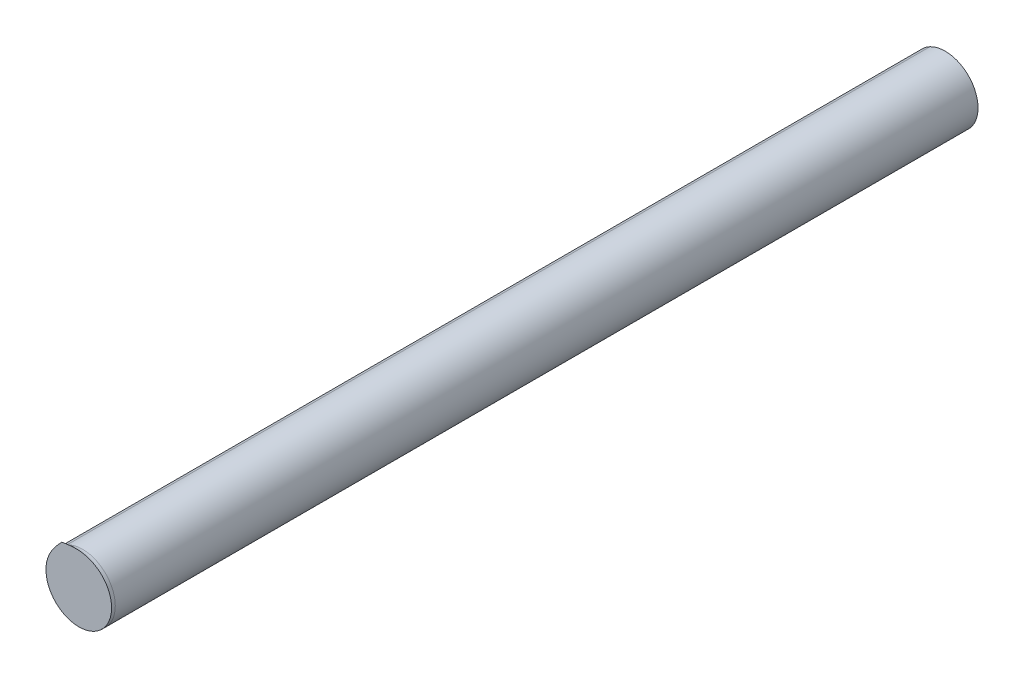
ISO-10303-21;
HEADER;
FILE_DESCRIPTION(('STEP AP214'),'2;1');
FILE_NAME('part.step','',(''),(''),'','','');
FILE_SCHEMA(('AUTOMOTIVE_DESIGN { 1 0 10303 214 1 1 1 1 }'));
ENDSEC;
DATA;
#1=APPLICATION_CONTEXT('core data for automotive mechanical design processes');
#2=APPLICATION_PROTOCOL_DEFINITION('international standard','automotive_design',2000,#1);
#3=PRODUCT_CONTEXT('',#1,'mechanical');
#4=PRODUCT('Part','Part','',(#3));
#5=PRODUCT_RELATED_PRODUCT_CATEGORY('part','',(#4));
#6=PRODUCT_DEFINITION_FORMATION('','',#4);
#7=PRODUCT_DEFINITION_CONTEXT('part definition',#1,'design');
#8=PRODUCT_DEFINITION('design','',#6,#7);
#9=PRODUCT_DEFINITION_SHAPE('','',#8);
#10=(LENGTH_UNIT() NAMED_UNIT(*) SI_UNIT(.MILLI.,.METRE.));
#11=(NAMED_UNIT(*) PLANE_ANGLE_UNIT() SI_UNIT($,.RADIAN.));
#12=(NAMED_UNIT(*) SI_UNIT($,.STERADIAN.) SOLID_ANGLE_UNIT());
#13=UNCERTAINTY_MEASURE_WITH_UNIT(LENGTH_MEASURE(1.E-05),#10,'distance_accuracy_value','');
#14=(GEOMETRIC_REPRESENTATION_CONTEXT(3) GLOBAL_UNCERTAINTY_ASSIGNED_CONTEXT((#13)) GLOBAL_UNIT_ASSIGNED_CONTEXT((#10,
#11,#12)) REPRESENTATION_CONTEXT('',''));
#15=CARTESIAN_POINT('',(0.,0.,0.));
#16=DIRECTION('',(0.,0.,1.));
#17=DIRECTION('',(1.,0.,0.));
#18=AXIS2_PLACEMENT_3D('',#15,#16,#17);
#19=CARTESIAN_POINT('',(2.552462506594,0.304851094896,-7.3152));
#20=DIRECTION('',(0.,0.,1.));
#21=DIRECTION('',(1.,0.,0.));
#22=AXIS2_PLACEMENT_3D('',#19,#20,#21);
#23=PLANE('',#22);
#24=CARTESIAN_POINT('',(2.552462506594,0.304851094896,-7.3152));
#25=DIRECTION('',(0.,0.,1.));
#26=DIRECTION('',(-0.467775560933961,0.883847285786927,0.));
#27=AXIS2_PLACEMENT_3D('',#24,#25,#26);
#28=CIRCLE('',#27,0.2286);
#29=CARTESIAN_POINT('',(2.445529013364,0.506898584427,-7.3152));
#30=VERTEX_POINT('',#29);
#31=CARTESIAN_POINT('',(2.659395999823,0.102803605365,-7.3152));
#32=VERTEX_POINT('',#31);
#33=EDGE_CURVE('E74',#30,#32,#28,.T.);
#34=ORIENTED_EDGE('',*,*,#33,.F.);
#35=CARTESIAN_POINT('',(2.552462506594,0.304851094896,-7.3152));
#36=DIRECTION('',(0.,0.,1.));
#37=DIRECTION('',(0.467775560933961,-0.883847285786927,0.));
#38=AXIS2_PLACEMENT_3D('',#35,#36,#37);
#39=CIRCLE('',#38,0.2286);
#40=EDGE_CURVE('E11',#32,#30,#39,.T.);
#41=ORIENTED_EDGE('',*,*,#40,.F.);
#42=EDGE_LOOP('',(#34,#41));
#43=FACE_BOUND('',#42,.T.);
#44=ADVANCED_FACE('F16',(#43),#23,.F.);
#45=CARTESIAN_POINT('',(2.552462506594,0.304851094896,-1.175004));
#46=DIRECTION('',(0.,0.,1.));
#47=DIRECTION('',(-0.467775560935937,0.883847285785881,0.));
#48=AXIS2_PLACEMENT_3D('',#45,#46,#47);
#49=CYLINDRICAL_SURFACE('',#48,0.2286);
#50=DIRECTION('',(0.,0.,1.));
#51=VECTOR('',#50,1.);
#52=CARTESIAN_POINT('',(2.659395999823,0.102803605365,-7.3152));
#53=LINE('',#52,#51);
#54=CARTESIAN_POINT('',(2.659395999823,0.102803605365,-1.2954));
#55=VERTEX_POINT('',#54);
#56=EDGE_CURVE('E27',#32,#55,#53,.T.);
#57=ORIENTED_EDGE('',*,*,#56,.F.);
#58=ORIENTED_EDGE('',*,*,#40,.T.);
#59=DIRECTION('',(0.,0.,-1.));
#60=VECTOR('',#59,1.);
#61=CARTESIAN_POINT('',(2.445529013364,0.506898584427,-1.2954));
#62=LINE('',#61,#60);
#63=CARTESIAN_POINT('',(2.445529013364,0.506898584427,-1.2954));
#64=VERTEX_POINT('',#63);
#65=EDGE_CURVE('E69',#64,#30,#62,.T.);
#66=ORIENTED_EDGE('',*,*,#65,.F.);
#67=CARTESIAN_POINT('',(2.552462506594,0.304851094896,-1.2954));
#68=DIRECTION('',(0.,0.,1.));
#69=DIRECTION('',(0.467775560933961,-0.883847285786927,0.));
#70=AXIS2_PLACEMENT_3D('',#67,#68,#69);
#71=CIRCLE('',#70,0.2286);
#72=EDGE_CURVE('E71',#55,#64,#71,.T.);
#73=ORIENTED_EDGE('',*,*,#72,.F.);
#74=EDGE_LOOP('',(#57,#58,#66,#73));
#75=FACE_BOUND('',#74,.T.);
#76=ADVANCED_FACE('F18',(#75),#49,.T.);
#77=CARTESIAN_POINT('',(2.552462506594,0.304851094896,-1.175004));
#78=DIRECTION('',(0.,0.,1.));
#79=DIRECTION('',(-0.467775560935937,0.883847285785881,0.));
#80=AXIS2_PLACEMENT_3D('',#77,#78,#79);
#81=CYLINDRICAL_SURFACE('',#80,0.2286);
#82=ORIENTED_EDGE('',*,*,#65,.T.);
#83=ORIENTED_EDGE('',*,*,#33,.T.);
#84=ORIENTED_EDGE('',*,*,#56,.T.);
#85=CARTESIAN_POINT('',(2.552462506594,0.304851094896,-1.2954));
#86=DIRECTION('',(0.,0.,1.));
#87=DIRECTION('',(-0.467775560935937,0.883847285785881,0.));
#88=AXIS2_PLACEMENT_3D('',#85,#86,#87);
#89=CIRCLE('',#88,0.2286);
#90=EDGE_CURVE('E75',#64,#55,#89,.T.);
#91=ORIENTED_EDGE('',*,*,#90,.F.);
#92=EDGE_LOOP('',(#82,#83,#84,#91));
#93=FACE_BOUND('',#92,.T.);
#94=ADVANCED_FACE('F78',(#93),#81,.T.);
#95=CARTESIAN_POINT('',(2.433647514116,0.529348305486,-1.2954));
#96=DIRECTION('',(0.883847285786927,0.467775560933961,0.));
#97=DIRECTION('',(0.,0.,-1.));
#98=AXIS2_PLACEMENT_3D('',#95,#96,#97);
#99=TOROIDAL_SURFACE('',#98,0.254,0.2286);
#100=CARTESIAN_POINT('',(2.433647514116,0.529348305486,-1.2954));
#101=DIRECTION('',(-0.883847285786927,-0.467775560933961,0.));
#102=DIRECTION('',(0.467775560933961,-0.883847285786927,0.));
#103=AXIS2_PLACEMENT_3D('',#100,#101,#102);
#104=CIRCLE('',#103,0.0254);
#105=CARTESIAN_POINT('',(2.433647514116,0.529348305486,-1.27));
#106=VERTEX_POINT('',#105);
#107=EDGE_CURVE('E84',#64,#106,#104,.T.);
#108=ORIENTED_EDGE('',*,*,#107,.F.);
#109=ORIENTED_EDGE('',*,*,#90,.T.);
#110=CARTESIAN_POINT('',(2.433647514116,0.529348305486,-1.2954));
#111=DIRECTION('',(0.883847285786737,0.46777556093432,0.));
#112=DIRECTION('',(0.467127223046947,-0.8826222716349,0.052631578947404));
#113=AXIS2_PLACEMENT_3D('',#110,#111,#112);
#114=CIRCLE('',#113,0.4826);
#115=CARTESIAN_POINT('',(2.659083111958,0.103394797195,-1.27));
#116=VERTEX_POINT('',#115);
#117=EDGE_CURVE('E20',#116,#55,#114,.T.);
#118=ORIENTED_EDGE('',*,*,#117,.F.);
#119=CARTESIAN_POINT('',(2.433647514116,0.529348305486,-1.27));
#120=CARTESIAN_POINT('',(2.426350525861,0.521705783658,-1.27));
#121=CARTESIAN_POINT('',(2.412542538473,0.507208242984,-1.27));
#122=CARTESIAN_POINT('',(2.394987999441,0.487482414724,-1.27));
#123=CARTESIAN_POINT('',(2.380121048054,0.468948764031,-1.27));
#124=CARTESIAN_POINT('',(2.367519717214,0.451136015618,-1.27));
#125=CARTESIAN_POINT('',(2.356699596837,0.433497909899,-1.27));
#126=CARTESIAN_POINT('',(2.347350192833,0.415581999554,-1.27));
#127=CARTESIAN_POINT('',(2.339194631542,0.396685331612,-1.27));
#128=CARTESIAN_POINT('',(2.332171707986,0.376002038655,-1.27));
#129=CARTESIAN_POINT('',(2.326510859808,0.35260532121,-1.27));
#130=CARTESIAN_POINT('',(2.322994041198,0.326324832893,-1.27));
#131=CARTESIAN_POINT('',(2.322467046259,0.298825239669,-1.27));
#132=CARTESIAN_POINT('',(2.325228959274,0.270956818124,-1.27));
#133=CARTESIAN_POINT('',(2.33123212225,0.243876603143,-1.27));
#134=CARTESIAN_POINT('',(2.340320902448,0.217898868685,-1.27));
#135=CARTESIAN_POINT('',(2.352318983572,0.193341783895,-1.27));
#136=CARTESIAN_POINT('',(2.367200942917,0.170278263527,-1.27));
#137=CARTESIAN_POINT('',(2.384593480133,0.149280035834,-1.27));
#138=CARTESIAN_POINT('',(2.404400482756,0.130437856968,-1.27));
#139=CARTESIAN_POINT('',(2.426187526687,0.114157260827,-1.27));
#140=CARTESIAN_POINT('',(2.449828111391,0.100525664072,-1.27));
#141=CARTESIAN_POINT('',(2.474807963867,0.08983898453229,-1.27));
#142=CARTESIAN_POINT('',(2.500955400242,0.08216355675663,-1.27));
#143=CARTESIAN_POINT('',(2.527734434613,0.07765825149233,-1.27));
#144=CARTESIAN_POINT('',(2.554925772366,0.07635348499519,-1.27));
#145=CARTESIAN_POINT('',(2.58201242486,0.0782789502587,-1.27));
#146=CARTESIAN_POINT('',(2.608718510388,0.08340425230996,-1.27));
#147=CARTESIAN_POINT('',(2.634618121122,0.09166491972476,-1.27));
#148=CARTESIAN_POINT('',(2.651052882397,0.09914480378757,-1.27));
#149=CARTESIAN_POINT('',(2.659083111958,0.103394797195,-1.27));
#150=(BOUNDED_CURVE() B_SPLINE_CURVE(3,(#119,#120,#121,#122,#123,#124,#125,#126,#127,#128,#129,
#130,#131,#132,#133,#134,#135,#136,#137,#138,#139,#140,#141,#142,#143,#144,#145,#146,#147,#148,
#149),.UNSPECIFIED.,.F.,.F.) B_SPLINE_CURVE_WITH_KNOTS((4,1,1,1,1,1,1,1,1,1,1,1,1,1,1,1,1,1,1,1,
1,1,1,1,1,1,1,1,4),(0.,0.03571428571429,0.07142857142857,0.107142857143,0.142857142857,
0.178571428571,0.214285714286,0.25,0.285714285714,0.321428571429,0.357142857143,0.392857142857,
0.428571428571,0.464285714286,0.5,0.535714285714,0.571428571429,0.607142857143,0.642857142857,
0.678571428571,0.714285714286,0.75,0.785714285714,0.821428571429,0.857142857143,0.892857142857,
0.928571428571,0.964285714286,1.),
.UNSPECIFIED.) CURVE() GEOMETRIC_REPRESENTATION_ITEM() RATIONAL_B_SPLINE_CURVE((1.,1.,1.,1.,1.,
1.,1.,1.,1.,1.,1.,1.,1.,1.,1.,1.,1.,1.,1.,1.,1.,1.,1.,1.,1.,1.,1.,1.,1.,1.,1.)) REPRESENTATION_ITEM(''));
#151=EDGE_CURVE('E53',#106,#116,#150,.T.);
#152=ORIENTED_EDGE('',*,*,#151,.F.);
#153=EDGE_LOOP('',(#108,#109,#118,#152));
#154=FACE_BOUND('',#153,.T.);
#155=ADVANCED_FACE('F85',(#154),#99,.T.);
#156=CARTESIAN_POINT('',(2.551711724829,0.308363292569,-1.27));
#157=DIRECTION('',(0.,0.,1.));
#158=DIRECTION('',(1.,0.,0.));
#159=AXIS2_PLACEMENT_3D('',#156,#157,#158);
#160=PLANE('',#159);
#161=ORIENTED_EDGE('',*,*,#151,.T.);
#162=CARTESIAN_POINT('',(2.433647514116,0.529348305486,-1.27));
#163=CARTESIAN_POINT('',(2.444180655601,0.531102455274,-1.27));
#164=CARTESIAN_POINT('',(2.464117700007,0.53439647131,-1.27));
#165=CARTESIAN_POINT('',(2.490468507455,0.537822781516,-1.27));
#166=CARTESIAN_POINT('',(2.514221930977,0.539668915858,-1.27));
#167=CARTESIAN_POINT('',(2.536045700677,0.540035763034,-1.27));
#168=CARTESIAN_POINT('',(2.556599483435,0.539033043917,-1.27));
#169=CARTESIAN_POINT('',(2.576457706063,0.536690522004,-1.27));
#170=CARTESIAN_POINT('',(2.596513884374,0.532827493612,-1.27));
#171=CARTESIAN_POINT('',(2.617521709434,0.527022637428,-1.27));
#172=CARTESIAN_POINT('',(2.640251623619,0.518451324381,-1.27));
#173=CARTESIAN_POINT('',(2.663749408117,0.506666280142,-1.27));
#174=CARTESIAN_POINT('',(2.686871900228,0.49159318911,-1.27));
#175=CARTESIAN_POINT('',(2.708538941004,0.473447653261,-1.27));
#176=CARTESIAN_POINT('',(2.727496032094,0.45324426674,-1.27));
#177=CARTESIAN_POINT('',(2.743779114036,0.431189247508,-1.27));
#178=CARTESIAN_POINT('',(2.757322196942,0.407436723999,-1.27));
#179=CARTESIAN_POINT('',(2.767991978491,0.382169968642,-1.27));
#180=CARTESIAN_POINT('',(2.775551528868,0.355967893795,-1.27));
#181=CARTESIAN_POINT('',(2.779964127323,0.329032941946,-1.27));
#182=CARTESIAN_POINT('',(2.781154538909,0.301858548685,-1.27));
#183=CARTESIAN_POINT('',(2.779117057297,0.274684720949,-1.27));
#184=CARTESIAN_POINT('',(2.773889520462,0.248017301107,-1.27));
#185=CARTESIAN_POINT('',(2.765531884061,0.222124158302,-1.27));
#186=CARTESIAN_POINT('',(2.754186114281,0.197448521172,-1.27));
#187=CARTESIAN_POINT('',(2.739986098381,0.174268833434,-1.27));
#188=CARTESIAN_POINT('',(2.723155208624,0.152956688044,-1.27));
#189=CARTESIAN_POINT('',(2.70391750906,0.133782725866,-1.27));
#190=CARTESIAN_POINT('',(2.68252496309,0.117017292663,-1.27));
#191=CARTESIAN_POINT('',(2.667107648941,0.107641777809,-1.27));
#192=CARTESIAN_POINT('',(2.659083111958,0.103394797195,-1.27));
#193=(BOUNDED_CURVE() B_SPLINE_CURVE(3,(#162,#163,#164,#165,#166,#167,#168,#169,#170,#171,#172,
#173,#174,#175,#176,#177,#178,#179,#180,#181,#182,#183,#184,#185,#186,#187,#188,#189,#190,#191,
#192),.UNSPECIFIED.,.F.,.F.) B_SPLINE_CURVE_WITH_KNOTS((4,1,1,1,1,1,1,1,1,1,1,1,1,1,1,1,1,1,1,1,
1,1,1,1,1,1,1,1,4),(0.,0.03571428571429,0.07142857142857,0.107142857143,0.142857142857,
0.178571428571,0.214285714286,0.25,0.285714285714,0.321428571429,0.357142857143,0.392857142857,
0.428571428571,0.464285714286,0.5,0.535714285714,0.571428571429,0.607142857143,0.642857142857,
0.678571428571,0.714285714286,0.75,0.785714285714,0.821428571429,0.857142857143,0.892857142857,
0.928571428571,0.964285714286,1.),
.UNSPECIFIED.) CURVE() GEOMETRIC_REPRESENTATION_ITEM() RATIONAL_B_SPLINE_CURVE((1.,1.,1.,1.,1.,
1.,1.,1.,1.,1.,1.,1.,1.,1.,1.,1.,1.,1.,1.,1.,1.,1.,1.,1.,1.,1.,1.,1.,1.,1.,1.)) REPRESENTATION_ITEM(''));
#194=EDGE_CURVE('E88',#106,#116,#193,.T.);
#195=ORIENTED_EDGE('',*,*,#194,.F.);
#196=EDGE_LOOP('',(#161,#195));
#197=FACE_BOUND('',#196,.T.);
#198=ADVANCED_FACE('F158',(#197),#160,.T.);
#199=CARTESIAN_POINT('',(2.433647514116,0.529348305486,-1.2954));
#200=DIRECTION('',(0.883847285786927,0.467775560933961,0.));
#201=DIRECTION('',(0.,0.,-1.));
#202=AXIS2_PLACEMENT_3D('',#199,#200,#201);
#203=TOROIDAL_SURFACE('',#202,0.254,0.2286);
#204=ORIENTED_EDGE('',*,*,#117,.T.);
#205=ORIENTED_EDGE('',*,*,#72,.T.);
#206=ORIENTED_EDGE('',*,*,#107,.T.);
#207=ORIENTED_EDGE('',*,*,#194,.T.);
#208=EDGE_LOOP('',(#204,#205,#206,#207));
#209=FACE_BOUND('',#208,.T.);
#210=ADVANCED_FACE('F90',(#209),#203,.T.);
#211=CLOSED_SHELL('',(#44,#76,#94,#155,#198,#210));
#212=MANIFOLD_SOLID_BREP('B1',#211);
#213=ADVANCED_BREP_SHAPE_REPRESENTATION('',(#18,#212),#14);
#214=SHAPE_DEFINITION_REPRESENTATION(#9,#213);
ENDSEC;
END-ISO-10303-21;
